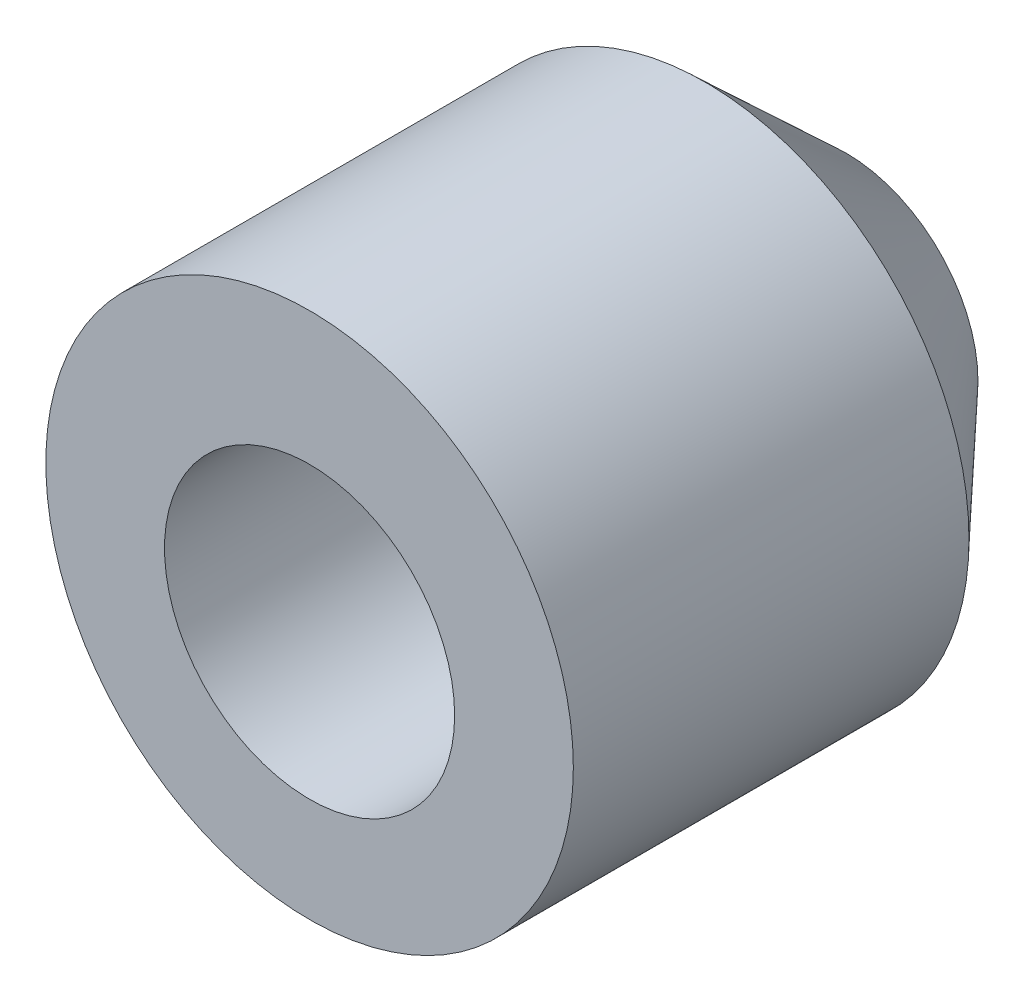
ISO-10303-21;
HEADER;
FILE_DESCRIPTION(('STEP AP214'),'2;1');
FILE_NAME('part.step','',(''),(''),'','','');
FILE_SCHEMA(('AUTOMOTIVE_DESIGN { 1 0 10303 214 1 1 1 1 }'));
ENDSEC;
DATA;
#1=APPLICATION_CONTEXT('core data for automotive mechanical design processes');
#2=APPLICATION_PROTOCOL_DEFINITION('international standard','automotive_design',2000,#1);
#3=PRODUCT_CONTEXT('',#1,'mechanical');
#4=PRODUCT('Part','Part','',(#3));
#5=PRODUCT_RELATED_PRODUCT_CATEGORY('part','',(#4));
#6=PRODUCT_DEFINITION_FORMATION('','',#4);
#7=PRODUCT_DEFINITION_CONTEXT('part definition',#1,'design');
#8=PRODUCT_DEFINITION('design','',#6,#7);
#9=PRODUCT_DEFINITION_SHAPE('','',#8);
#10=(LENGTH_UNIT() NAMED_UNIT(*) SI_UNIT(.MILLI.,.METRE.));
#11=(NAMED_UNIT(*) PLANE_ANGLE_UNIT() SI_UNIT($,.RADIAN.));
#12=(NAMED_UNIT(*) SI_UNIT($,.STERADIAN.) SOLID_ANGLE_UNIT());
#13=UNCERTAINTY_MEASURE_WITH_UNIT(LENGTH_MEASURE(1.E-05),#10,'distance_accuracy_value','');
#14=(GEOMETRIC_REPRESENTATION_CONTEXT(3) GLOBAL_UNCERTAINTY_ASSIGNED_CONTEXT((#13)) GLOBAL_UNIT_ASSIGNED_CONTEXT((#10,
#11,#12)) REPRESENTATION_CONTEXT('',''));
#15=CARTESIAN_POINT('',(0.,0.,0.));
#16=DIRECTION('',(0.,0.,1.));
#17=DIRECTION('',(1.,0.,0.));
#18=AXIS2_PLACEMENT_3D('',#15,#16,#17);
#19=CARTESIAN_POINT('',(0.,8.19612590799031,0.));
#20=DIRECTION('',(0.,0.,1.));
#21=DIRECTION('',(1.,0.,0.));
#22=AXIS2_PLACEMENT_3D('',#19,#20,#21);
#23=CYLINDRICAL_SURFACE('',#22,10.);
#24=CARTESIAN_POINT('',(0.,8.19612590799031,-15.));
#25=DIRECTION('',(0.,0.,1.));
#26=DIRECTION('',(1.,0.,0.));
#27=AXIS2_PLACEMENT_3D('',#24,#25,#26);
#28=CIRCLE('',#27,10.);
#29=CARTESIAN_POINT('',(10.,8.19612590799031,-15.));
#30=VERTEX_POINT('',#29);
#31=EDGE_CURVE('E11',#30,#30,#28,.T.);
#32=ORIENTED_EDGE('',*,*,#31,.T.);
#33=EDGE_LOOP('',(#32));
#34=FACE_BOUND('',#33,.T.);
#35=CARTESIAN_POINT('',(0.,8.19612590799031,0.));
#36=DIRECTION('',(0.,0.,1.));
#37=DIRECTION('',(1.,0.,0.));
#38=AXIS2_PLACEMENT_3D('',#35,#36,#37);
#39=CIRCLE('',#38,10.);
#40=CARTESIAN_POINT('',(10.,8.19612590799031,0.));
#41=VERTEX_POINT('',#40);
#42=EDGE_CURVE('E51',#41,#41,#39,.T.);
#43=ORIENTED_EDGE('',*,*,#42,.F.);
#44=EDGE_LOOP('',(#43));
#45=FACE_BOUND('',#44,.T.);
#46=ADVANCED_FACE('F33',(#34,#45),#23,.T.);
#47=CARTESIAN_POINT('',(0.,8.19612590799031,-15.));
#48=DIRECTION('',(0.,0.,1.));
#49=DIRECTION('',(1.,0.,0.));
#50=AXIS2_PLACEMENT_3D('',#47,#48,#49);
#51=CONICAL_SURFACE('',#50,10.,0.752385292143477);
#52=CARTESIAN_POINT('',(0.,8.19612590799031,-20.3415275994734));
#53=DIRECTION('',(0.,0.,1.));
#54=DIRECTION('',(1.,0.,0.));
#55=AXIS2_PLACEMENT_3D('',#52,#53,#54);
#56=CIRCLE('',#55,5.);
#57=CARTESIAN_POINT('',(5.,8.19612590799031,-20.3415275994734));
#58=VERTEX_POINT('',#57);
#59=EDGE_CURVE('E39',#58,#58,#56,.T.);
#60=ORIENTED_EDGE('',*,*,#59,.T.);
#61=EDGE_LOOP('',(#60));
#62=FACE_BOUND('',#61,.T.);
#63=ORIENTED_EDGE('',*,*,#31,.F.);
#64=EDGE_LOOP('',(#63));
#65=FACE_BOUND('',#64,.T.);
#66=ADVANCED_FACE('F46',(#62,#65),#51,.T.);
#67=CARTESIAN_POINT('',(0.,8.19612590799031,-20.3415275994734));
#68=DIRECTION('',(0.,0.,-1.));
#69=DIRECTION('',(-1.,0.,0.));
#70=AXIS2_PLACEMENT_3D('',#67,#68,#69);
#71=CONICAL_SURFACE('',#70,5.,0.752385292143477);
#72=CARTESIAN_POINT('',(0.,8.19612590799031,-15.));
#73=VERTEX_POINT('',#72);
#74=VERTEX_LOOP('',#73);
#75=FACE_BOUND('',#74,.T.);
#76=ORIENTED_EDGE('',*,*,#59,.F.);
#77=EDGE_LOOP('',(#76));
#78=FACE_BOUND('',#77,.T.);
#79=ADVANCED_FACE('F42',(#75,#78),#71,.F.);
#80=CARTESIAN_POINT('',(0.,-1.80387409200969,0.));
#81=DIRECTION('',(0.,0.,1.));
#82=DIRECTION('',(1.,0.,0.));
#83=AXIS2_PLACEMENT_3D('',#80,#81,#82);
#84=PLANE('',#83);
#85=CARTESIAN_POINT('',(0.,7.64744392949306,0.));
#86=DIRECTION('',(0.,0.,1.));
#87=DIRECTION('',(1.,0.,0.));
#88=AXIS2_PLACEMENT_3D('',#85,#86,#87);
#89=CIRCLE('',#88,5.5);
#90=CARTESIAN_POINT('',(5.5,7.64744392949306,0.));
#91=VERTEX_POINT('',#90);
#92=EDGE_CURVE('E56',#91,#91,#89,.T.);
#93=ORIENTED_EDGE('',*,*,#92,.F.);
#94=EDGE_LOOP('',(#93));
#95=FACE_BOUND('',#94,.T.);
#96=ORIENTED_EDGE('',*,*,#42,.T.);
#97=EDGE_LOOP('',(#96));
#98=FACE_BOUND('',#97,.T.);
#99=ADVANCED_FACE('F45',(#95,#98),#84,.T.);
#100=CARTESIAN_POINT('',(0.,7.64744392949306,-10.));
#101=DIRECTION('',(0.,0.,1.));
#102=DIRECTION('',(1.,0.,0.));
#103=AXIS2_PLACEMENT_3D('',#100,#101,#102);
#104=CYLINDRICAL_SURFACE('',#103,5.5);
#105=CARTESIAN_POINT('',(0.,7.64744392949306,-10.));
#106=DIRECTION('',(0.,0.,1.));
#107=DIRECTION('',(1.,0.,0.));
#108=AXIS2_PLACEMENT_3D('',#105,#106,#107);
#109=CIRCLE('',#108,5.5);
#110=CARTESIAN_POINT('',(5.5,7.64744392949306,-10.));
#111=VERTEX_POINT('',#110);
#112=EDGE_CURVE('E53',#111,#111,#109,.T.);
#113=ORIENTED_EDGE('',*,*,#112,.F.);
#114=EDGE_LOOP('',(#113));
#115=FACE_BOUND('',#114,.T.);
#116=ORIENTED_EDGE('',*,*,#92,.T.);
#117=EDGE_LOOP('',(#116));
#118=FACE_BOUND('',#117,.T.);
#119=ADVANCED_FACE('F64',(#115,#118),#104,.F.);
#120=CARTESIAN_POINT('',(0.,7.64744392949306,-10.));
#121=DIRECTION('',(0.,0.,1.));
#122=DIRECTION('',(1.,0.,0.));
#123=AXIS2_PLACEMENT_3D('',#120,#121,#122);
#124=PLANE('',#123);
#125=ORIENTED_EDGE('',*,*,#112,.T.);
#126=EDGE_LOOP('',(#125));
#127=FACE_BOUND('',#126,.T.);
#128=ADVANCED_FACE('F62',(#127),#124,.T.);
#129=CLOSED_SHELL('',(#46,#66,#79,#99,#119,#128));
#130=MANIFOLD_SOLID_BREP('B2',#129);
#131=ADVANCED_BREP_SHAPE_REPRESENTATION('',(#18,#130),#14);
#132=SHAPE_DEFINITION_REPRESENTATION(#9,#131);
ENDSEC;
END-ISO-10303-21;
